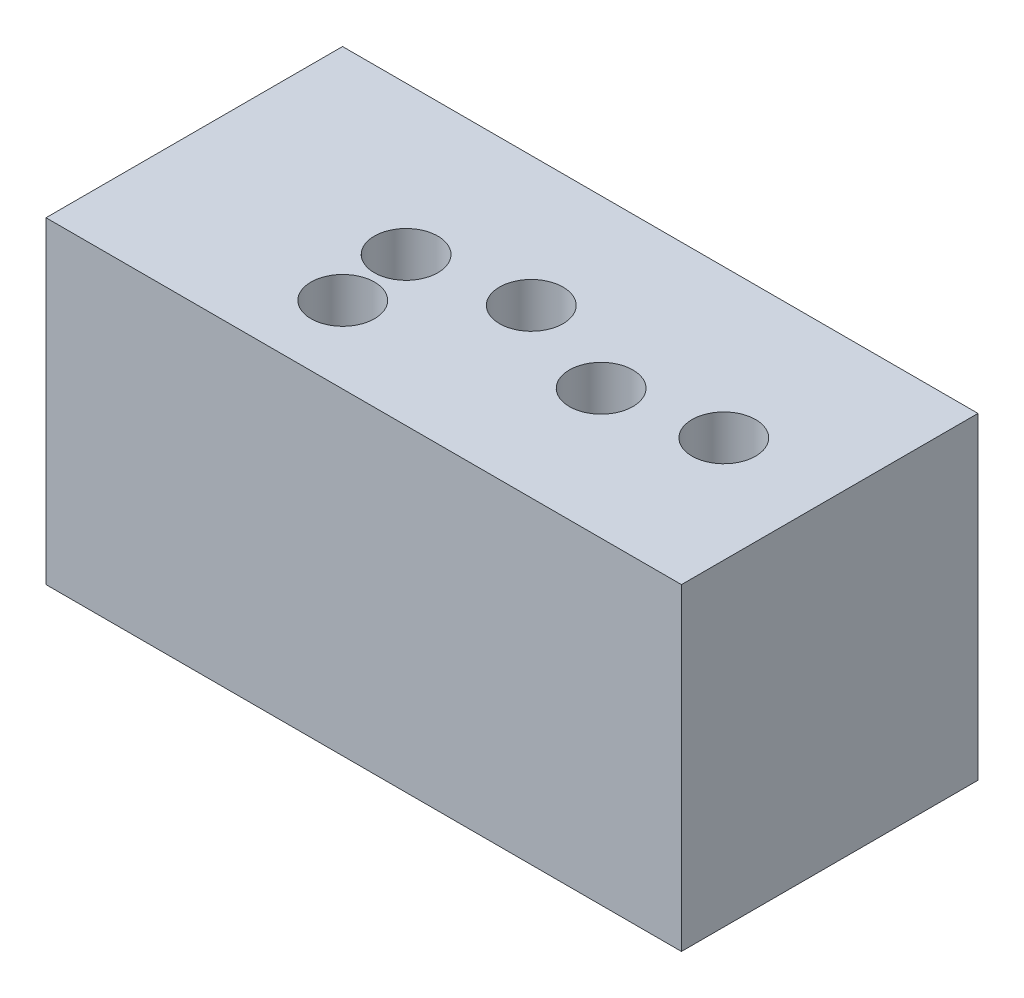
ISO-10303-21;
HEADER;
FILE_DESCRIPTION(('STEP AP214'),'2;1');
FILE_NAME('part.step','',(''),(''),'','','');
FILE_SCHEMA(('AUTOMOTIVE_DESIGN { 1 0 10303 214 1 1 1 1 }'));
ENDSEC;
DATA;
#1=APPLICATION_CONTEXT('core data for automotive mechanical design processes');
#2=APPLICATION_PROTOCOL_DEFINITION('international standard','automotive_design',2000,#1);
#3=PRODUCT_CONTEXT('',#1,'mechanical');
#4=PRODUCT('Part','Part','',(#3));
#5=PRODUCT_RELATED_PRODUCT_CATEGORY('part','',(#4));
#6=PRODUCT_DEFINITION_FORMATION('','',#4);
#7=PRODUCT_DEFINITION_CONTEXT('part definition',#1,'design');
#8=PRODUCT_DEFINITION('design','',#6,#7);
#9=PRODUCT_DEFINITION_SHAPE('','',#8);
#10=(LENGTH_UNIT() NAMED_UNIT(*) SI_UNIT(.MILLI.,.METRE.));
#11=(NAMED_UNIT(*) PLANE_ANGLE_UNIT() SI_UNIT($,.RADIAN.));
#12=(NAMED_UNIT(*) SI_UNIT($,.STERADIAN.) SOLID_ANGLE_UNIT());
#13=UNCERTAINTY_MEASURE_WITH_UNIT(LENGTH_MEASURE(1.E-05),#10,'distance_accuracy_value','');
#14=(GEOMETRIC_REPRESENTATION_CONTEXT(3) GLOBAL_UNCERTAINTY_ASSIGNED_CONTEXT((#13)) GLOBAL_UNIT_ASSIGNED_CONTEXT((#10,
#11,#12)) REPRESENTATION_CONTEXT('',''));
#15=CARTESIAN_POINT('',(0.,0.,0.));
#16=DIRECTION('',(0.,0.,1.));
#17=DIRECTION('',(1.,0.,0.));
#18=AXIS2_PLACEMENT_3D('',#15,#16,#17);
#19=CARTESIAN_POINT('',(0.,9.525,0.));
#20=DIRECTION('',(1.,0.,0.));
#21=DIRECTION('',(0.,0.,-1.));
#22=AXIS2_PLACEMENT_3D('',#19,#20,#21);
#23=PLANE('',#22);
#24=DIRECTION('',(0.,0.,1.));
#25=VECTOR('',#24,1.);
#26=CARTESIAN_POINT('',(0.,-9.525,0.));
#27=LINE('',#26,#25);
#28=CARTESIAN_POINT('',(0.,-9.525,-17.78));
#29=VERTEX_POINT('',#28);
#30=CARTESIAN_POINT('',(0.,-9.525,0.));
#31=VERTEX_POINT('',#30);
#32=EDGE_CURVE('E100',#29,#31,#27,.T.);
#33=ORIENTED_EDGE('',*,*,#32,.T.);
#34=DIRECTION('',(0.,-1.,0.));
#35=VECTOR('',#34,1.);
#36=CARTESIAN_POINT('',(0.,9.525,0.));
#37=LINE('',#36,#35);
#38=CARTESIAN_POINT('',(0.,9.525,0.));
#39=VERTEX_POINT('',#38);
#40=EDGE_CURVE('E11',#39,#31,#37,.T.);
#41=ORIENTED_EDGE('',*,*,#40,.F.);
#42=DIRECTION('',(0.,0.,1.));
#43=VECTOR('',#42,1.);
#44=CARTESIAN_POINT('',(0.,9.525,0.));
#45=LINE('',#44,#43);
#46=CARTESIAN_POINT('',(0.,9.525,-17.78));
#47=VERTEX_POINT('',#46);
#48=EDGE_CURVE('E88',#47,#39,#45,.T.);
#49=ORIENTED_EDGE('',*,*,#48,.F.);
#50=DIRECTION('',(0.,-1.,0.));
#51=VECTOR('',#50,1.);
#52=CARTESIAN_POINT('',(0.,9.525,-17.78));
#53=LINE('',#52,#51);
#54=EDGE_CURVE('E96',#47,#29,#53,.T.);
#55=ORIENTED_EDGE('',*,*,#54,.T.);
#56=EDGE_LOOP('',(#33,#41,#49,#55));
#57=FACE_BOUND('',#56,.T.);
#58=ADVANCED_FACE('F37',(#57),#23,.F.);
#59=CARTESIAN_POINT('',(0.,9.525,0.));
#60=DIRECTION('',(0.,0.,-1.));
#61=DIRECTION('',(-1.,0.,0.));
#62=AXIS2_PLACEMENT_3D('',#59,#60,#61);
#63=PLANE('',#62);
#64=DIRECTION('',(1.,0.,0.));
#65=VECTOR('',#64,1.);
#66=CARTESIAN_POINT('',(0.,-9.525,0.));
#67=LINE('',#66,#65);
#68=CARTESIAN_POINT('',(38.1,-9.525,0.));
#69=VERTEX_POINT('',#68);
#70=EDGE_CURVE('E92',#31,#69,#67,.T.);
#71=ORIENTED_EDGE('',*,*,#70,.T.);
#72=DIRECTION('',(0.,-1.,0.));
#73=VECTOR('',#72,1.);
#74=CARTESIAN_POINT('',(38.1,9.525,0.));
#75=LINE('',#74,#73);
#76=CARTESIAN_POINT('',(38.1,9.525,0.));
#77=VERTEX_POINT('',#76);
#78=EDGE_CURVE('E45',#77,#69,#75,.T.);
#79=ORIENTED_EDGE('',*,*,#78,.F.);
#80=DIRECTION('',(1.,0.,0.));
#81=VECTOR('',#80,1.);
#82=CARTESIAN_POINT('',(0.,9.525,0.));
#83=LINE('',#82,#81);
#84=EDGE_CURVE('E83',#39,#77,#83,.T.);
#85=ORIENTED_EDGE('',*,*,#84,.F.);
#86=ORIENTED_EDGE('',*,*,#40,.T.);
#87=EDGE_LOOP('',(#71,#79,#85,#86));
#88=FACE_BOUND('',#87,.T.);
#89=ADVANCED_FACE('F91',(#88),#63,.F.);
#90=CARTESIAN_POINT('',(38.1,9.525,0.));
#91=DIRECTION('',(-1.,0.,0.));
#92=DIRECTION('',(0.,0.,1.));
#93=AXIS2_PLACEMENT_3D('',#90,#91,#92);
#94=PLANE('',#93);
#95=DIRECTION('',(0.,0.,-1.));
#96=VECTOR('',#95,1.);
#97=CARTESIAN_POINT('',(38.1,-9.525,0.));
#98=LINE('',#97,#96);
#99=CARTESIAN_POINT('',(38.1,-9.525,-17.78));
#100=VERTEX_POINT('',#99);
#101=EDGE_CURVE('E70',#69,#100,#98,.T.);
#102=ORIENTED_EDGE('',*,*,#101,.T.);
#103=DIRECTION('',(0.,-1.,0.));
#104=VECTOR('',#103,1.);
#105=CARTESIAN_POINT('',(38.1,9.525,-17.78));
#106=LINE('',#105,#104);
#107=CARTESIAN_POINT('',(38.1,9.525,-17.78));
#108=VERTEX_POINT('',#107);
#109=EDGE_CURVE('E93',#108,#100,#106,.T.);
#110=ORIENTED_EDGE('',*,*,#109,.F.);
#111=DIRECTION('',(0.,0.,-1.));
#112=VECTOR('',#111,1.);
#113=CARTESIAN_POINT('',(38.1,9.525,0.));
#114=LINE('',#113,#112);
#115=EDGE_CURVE('E86',#77,#108,#114,.T.);
#116=ORIENTED_EDGE('',*,*,#115,.F.);
#117=ORIENTED_EDGE('',*,*,#78,.T.);
#118=EDGE_LOOP('',(#102,#110,#116,#117));
#119=FACE_BOUND('',#118,.T.);
#120=ADVANCED_FACE('F94',(#119),#94,.F.);
#121=CARTESIAN_POINT('',(0.,9.525,-17.78));
#122=DIRECTION('',(0.,0.,1.));
#123=DIRECTION('',(1.,0.,0.));
#124=AXIS2_PLACEMENT_3D('',#121,#122,#123);
#125=PLANE('',#124);
#126=DIRECTION('',(-1.,0.,0.));
#127=VECTOR('',#126,1.);
#128=CARTESIAN_POINT('',(0.,-9.525,-17.78));
#129=LINE('',#128,#127);
#130=EDGE_CURVE('E76',#100,#29,#129,.T.);
#131=ORIENTED_EDGE('',*,*,#130,.T.);
#132=ORIENTED_EDGE('',*,*,#54,.F.);
#133=DIRECTION('',(-1.,0.,0.));
#134=VECTOR('',#133,1.);
#135=CARTESIAN_POINT('',(0.,9.525,-17.78));
#136=LINE('',#135,#134);
#137=EDGE_CURVE('E53',#108,#47,#136,.T.);
#138=ORIENTED_EDGE('',*,*,#137,.F.);
#139=ORIENTED_EDGE('',*,*,#109,.T.);
#140=EDGE_LOOP('',(#131,#132,#138,#139));
#141=FACE_BOUND('',#140,.T.);
#142=ADVANCED_FACE('F108',(#141),#125,.F.);
#143=CARTESIAN_POINT('',(0.,9.525,0.));
#144=DIRECTION('',(0.,-1.,0.));
#145=DIRECTION('',(0.,0.,-1.));
#146=AXIS2_PLACEMENT_3D('',#143,#144,#145);
#147=PLANE('',#146);
#148=CARTESIAN_POINT('',(31.75,9.525,-8.89));
#149=DIRECTION('',(0.,1.,0.));
#150=DIRECTION('',(0.,0.,1.));
#151=AXIS2_PLACEMENT_3D('',#148,#149,#150);
#152=CIRCLE('',#151,1.90500000000001);
#153=CARTESIAN_POINT('',(31.75,9.525,-6.98499999999999));
#154=VERTEX_POINT('',#153);
#155=EDGE_CURVE('E127',#154,#154,#152,.T.);
#156=ORIENTED_EDGE('',*,*,#155,.F.);
#157=EDGE_LOOP('',(#156));
#158=FACE_BOUND('',#157,.T.);
#159=CARTESIAN_POINT('',(13.1882502658413,9.525,-4.60468241474936));
#160=DIRECTION('',(0.,1.,0.));
#161=DIRECTION('',(0.,0.,1.));
#162=AXIS2_PLACEMENT_3D('',#159,#160,#161);
#163=CIRCLE('',#162,1.90500000000001);
#164=CARTESIAN_POINT('',(13.1882502658413,9.525,-2.69968241474935));
#165=VERTEX_POINT('',#164);
#166=EDGE_CURVE('E131',#165,#165,#163,.T.);
#167=ORIENTED_EDGE('',*,*,#166,.F.);
#168=EDGE_LOOP('',(#167));
#169=FACE_BOUND('',#168,.T.);
#170=CARTESIAN_POINT('',(25.4964707683725,9.525,-7.78733407181498));
#171=DIRECTION('',(0.,1.,0.));
#172=DIRECTION('',(0.,0.,1.));
#173=AXIS2_PLACEMENT_3D('',#170,#171,#172);
#174=CIRCLE('',#173,1.90500000000001);
#175=CARTESIAN_POINT('',(25.4964707683725,9.525,-5.88233407181498));
#176=VERTEX_POINT('',#175);
#177=EDGE_CURVE('E118',#176,#176,#174,.T.);
#178=ORIENTED_EDGE('',*,*,#177,.F.);
#179=EDGE_LOOP('',(#178));
#180=FACE_BOUND('',#179,.T.);
#181=CARTESIAN_POINT('',(12.7,9.525,-8.89));
#182=DIRECTION('',(0.,1.,0.));
#183=DIRECTION('',(0.,0.,1.));
#184=AXIS2_PLACEMENT_3D('',#181,#182,#183);
#185=CIRCLE('',#184,1.90500000000001);
#186=CARTESIAN_POINT('',(12.7,9.525,-6.98499999999999));
#187=VERTEX_POINT('',#186);
#188=EDGE_CURVE('E117',#187,#187,#185,.T.);
#189=ORIENTED_EDGE('',*,*,#188,.F.);
#190=EDGE_LOOP('',(#189));
#191=FACE_BOUND('',#190,.T.);
#192=CARTESIAN_POINT('',(19.0983273342348,9.525,-9.99687793289517));
#193=DIRECTION('',(0.,1.,0.));
#194=DIRECTION('',(0.,0.,1.));
#195=AXIS2_PLACEMENT_3D('',#192,#193,#194);
#196=CIRCLE('',#195,1.90500000000001);
#197=CARTESIAN_POINT('',(19.0983273342348,9.525,-8.09187793289516));
#198=VERTEX_POINT('',#197);
#199=EDGE_CURVE('E124',#198,#198,#196,.T.);
#200=ORIENTED_EDGE('',*,*,#199,.F.);
#201=EDGE_LOOP('',(#200));
#202=FACE_BOUND('',#201,.T.);
#203=ORIENTED_EDGE('',*,*,#48,.T.);
#204=ORIENTED_EDGE('',*,*,#84,.T.);
#205=ORIENTED_EDGE('',*,*,#115,.T.);
#206=ORIENTED_EDGE('',*,*,#137,.T.);
#207=EDGE_LOOP('',(#203,#204,#205,#206));
#208=FACE_BOUND('',#207,.T.);
#209=ADVANCED_FACE('F84',(#158,#169,#180,#191,#202,#208),#147,.F.);
#210=CARTESIAN_POINT('',(0.,-9.525,0.));
#211=DIRECTION('',(0.,-1.,0.));
#212=DIRECTION('',(0.,0.,-1.));
#213=AXIS2_PLACEMENT_3D('',#210,#211,#212);
#214=PLANE('',#213);
#215=ORIENTED_EDGE('',*,*,#32,.F.);
#216=ORIENTED_EDGE('',*,*,#130,.F.);
#217=ORIENTED_EDGE('',*,*,#101,.F.);
#218=ORIENTED_EDGE('',*,*,#70,.F.);
#219=EDGE_LOOP('',(#215,#216,#217,#218));
#220=FACE_BOUND('',#219,.T.);
#221=ADVANCED_FACE('F111',(#220),#214,.T.);
#222=CARTESIAN_POINT('',(19.0983273342348,-3.175,-9.99687793289517));
#223=DIRECTION('',(0.,1.,0.));
#224=DIRECTION('',(0.,0.,1.));
#225=AXIS2_PLACEMENT_3D('',#222,#223,#224);
#226=CYLINDRICAL_SURFACE('',#225,1.90500000000001);
#227=CARTESIAN_POINT('',(19.0983273342348,-3.175,-9.99687793289517));
#228=DIRECTION('',(0.,1.,0.));
#229=DIRECTION('',(0.,0.,1.));
#230=AXIS2_PLACEMENT_3D('',#227,#228,#229);
#231=CIRCLE('',#230,1.90500000000001);
#232=CARTESIAN_POINT('',(19.0983273342348,-3.175,-8.09187793289516));
#233=VERTEX_POINT('',#232);
#234=EDGE_CURVE('E121',#233,#233,#231,.T.);
#235=ORIENTED_EDGE('',*,*,#234,.F.);
#236=EDGE_LOOP('',(#235));
#237=FACE_BOUND('',#236,.T.);
#238=ORIENTED_EDGE('',*,*,#199,.T.);
#239=EDGE_LOOP('',(#238));
#240=FACE_BOUND('',#239,.T.);
#241=ADVANCED_FACE('F164',(#237,#240),#226,.F.);
#242=CARTESIAN_POINT('',(19.0983273342348,-3.175,-9.99687793289517));
#243=DIRECTION('',(0.,1.,0.));
#244=DIRECTION('',(0.,0.,1.));
#245=AXIS2_PLACEMENT_3D('',#242,#243,#244);
#246=PLANE('',#245);
#247=ORIENTED_EDGE('',*,*,#234,.T.);
#248=EDGE_LOOP('',(#247));
#249=FACE_BOUND('',#248,.T.);
#250=ADVANCED_FACE('F166',(#249),#246,.T.);
#251=CARTESIAN_POINT('',(12.7,-3.175,-8.89));
#252=DIRECTION('',(0.,1.,0.));
#253=DIRECTION('',(0.,0.,1.));
#254=AXIS2_PLACEMENT_3D('',#251,#252,#253);
#255=CYLINDRICAL_SURFACE('',#254,1.90500000000001);
#256=CARTESIAN_POINT('',(12.7,-3.175,-8.89));
#257=DIRECTION('',(0.,1.,0.));
#258=DIRECTION('',(0.,0.,1.));
#259=AXIS2_PLACEMENT_3D('',#256,#257,#258);
#260=CIRCLE('',#259,1.90500000000001);
#261=CARTESIAN_POINT('',(12.7,-3.175,-6.98499999999999));
#262=VERTEX_POINT('',#261);
#263=EDGE_CURVE('E114',#262,#262,#260,.T.);
#264=ORIENTED_EDGE('',*,*,#263,.F.);
#265=EDGE_LOOP('',(#264));
#266=FACE_BOUND('',#265,.T.);
#267=ORIENTED_EDGE('',*,*,#188,.T.);
#268=EDGE_LOOP('',(#267));
#269=FACE_BOUND('',#268,.T.);
#270=ADVANCED_FACE('F173',(#266,#269),#255,.F.);
#271=CARTESIAN_POINT('',(12.7,-3.175,-8.89));
#272=DIRECTION('',(0.,1.,0.));
#273=DIRECTION('',(0.,0.,1.));
#274=AXIS2_PLACEMENT_3D('',#271,#272,#273);
#275=PLANE('',#274);
#276=ORIENTED_EDGE('',*,*,#263,.T.);
#277=EDGE_LOOP('',(#276));
#278=FACE_BOUND('',#277,.T.);
#279=ADVANCED_FACE('F190',(#278),#275,.T.);
#280=CARTESIAN_POINT('',(25.4964707683725,-3.175,-7.78733407181498));
#281=DIRECTION('',(0.,1.,0.));
#282=DIRECTION('',(0.,0.,1.));
#283=AXIS2_PLACEMENT_3D('',#280,#281,#282);
#284=CYLINDRICAL_SURFACE('',#283,1.90500000000001);
#285=CARTESIAN_POINT('',(25.4964707683725,-3.175,-7.78733407181498));
#286=DIRECTION('',(0.,1.,0.));
#287=DIRECTION('',(0.,0.,1.));
#288=AXIS2_PLACEMENT_3D('',#285,#286,#287);
#289=CIRCLE('',#288,1.90500000000001);
#290=CARTESIAN_POINT('',(25.4964707683725,-3.175,-5.88233407181498));
#291=VERTEX_POINT('',#290);
#292=EDGE_CURVE('E134',#291,#291,#289,.T.);
#293=ORIENTED_EDGE('',*,*,#292,.F.);
#294=EDGE_LOOP('',(#293));
#295=FACE_BOUND('',#294,.T.);
#296=ORIENTED_EDGE('',*,*,#177,.T.);
#297=EDGE_LOOP('',(#296));
#298=FACE_BOUND('',#297,.T.);
#299=ADVANCED_FACE('F193',(#295,#298),#284,.F.);
#300=CARTESIAN_POINT('',(25.4964707683725,-3.175,-7.78733407181498));
#301=DIRECTION('',(0.,1.,0.));
#302=DIRECTION('',(0.,0.,1.));
#303=AXIS2_PLACEMENT_3D('',#300,#301,#302);
#304=PLANE('',#303);
#305=ORIENTED_EDGE('',*,*,#292,.T.);
#306=EDGE_LOOP('',(#305));
#307=FACE_BOUND('',#306,.T.);
#308=ADVANCED_FACE('F213',(#307),#304,.T.);
#309=CARTESIAN_POINT('',(13.1882502658413,-3.175,-4.60468241474936));
#310=DIRECTION('',(0.,1.,0.));
#311=DIRECTION('',(0.,0.,1.));
#312=AXIS2_PLACEMENT_3D('',#309,#310,#311);
#313=CYLINDRICAL_SURFACE('',#312,1.90500000000001);
#314=CARTESIAN_POINT('',(13.1882502658413,-3.175,-4.60468241474936));
#315=DIRECTION('',(0.,1.,0.));
#316=DIRECTION('',(0.,0.,1.));
#317=AXIS2_PLACEMENT_3D('',#314,#315,#316);
#318=CIRCLE('',#317,1.90500000000001);
#319=CARTESIAN_POINT('',(13.1882502658413,-3.175,-2.69968241474935));
#320=VERTEX_POINT('',#319);
#321=EDGE_CURVE('E128',#320,#320,#318,.T.);
#322=ORIENTED_EDGE('',*,*,#321,.F.);
#323=EDGE_LOOP('',(#322));
#324=FACE_BOUND('',#323,.T.);
#325=ORIENTED_EDGE('',*,*,#166,.T.);
#326=EDGE_LOOP('',(#325));
#327=FACE_BOUND('',#326,.T.);
#328=ADVANCED_FACE('F221',(#324,#327),#313,.F.);
#329=CARTESIAN_POINT('',(13.1882502658413,-3.175,-4.60468241474936));
#330=DIRECTION('',(0.,1.,0.));
#331=DIRECTION('',(0.,0.,1.));
#332=AXIS2_PLACEMENT_3D('',#329,#330,#331);
#333=PLANE('',#332);
#334=ORIENTED_EDGE('',*,*,#321,.T.);
#335=EDGE_LOOP('',(#334));
#336=FACE_BOUND('',#335,.T.);
#337=ADVANCED_FACE('F149',(#336),#333,.T.);
#338=CARTESIAN_POINT('',(31.75,-3.175,-8.89));
#339=DIRECTION('',(0.,1.,0.));
#340=DIRECTION('',(0.,0.,1.));
#341=AXIS2_PLACEMENT_3D('',#338,#339,#340);
#342=CYLINDRICAL_SURFACE('',#341,1.90500000000001);
#343=CARTESIAN_POINT('',(31.75,-3.175,-8.89));
#344=DIRECTION('',(0.,1.,0.));
#345=DIRECTION('',(0.,0.,1.));
#346=AXIS2_PLACEMENT_3D('',#343,#344,#345);
#347=CIRCLE('',#346,1.90500000000001);
#348=CARTESIAN_POINT('',(31.75,-3.175,-6.98499999999999));
#349=VERTEX_POINT('',#348);
#350=EDGE_CURVE('E103',#349,#349,#347,.T.);
#351=ORIENTED_EDGE('',*,*,#350,.F.);
#352=EDGE_LOOP('',(#351));
#353=FACE_BOUND('',#352,.T.);
#354=ORIENTED_EDGE('',*,*,#155,.T.);
#355=EDGE_LOOP('',(#354));
#356=FACE_BOUND('',#355,.T.);
#357=ADVANCED_FACE('F146',(#353,#356),#342,.F.);
#358=CARTESIAN_POINT('',(31.75,-3.175,-8.89));
#359=DIRECTION('',(0.,1.,0.));
#360=DIRECTION('',(0.,0.,1.));
#361=AXIS2_PLACEMENT_3D('',#358,#359,#360);
#362=PLANE('',#361);
#363=ORIENTED_EDGE('',*,*,#350,.T.);
#364=EDGE_LOOP('',(#363));
#365=FACE_BOUND('',#364,.T.);
#366=ADVANCED_FACE('F144',(#365),#362,.T.);
#367=CLOSED_SHELL('',(#58,#89,#120,#142,#209,#221,#241,#250,#270,#279,#299,#308,#328,#337,#357,#366));
#368=MANIFOLD_SOLID_BREP('B2',#367);
#369=ADVANCED_BREP_SHAPE_REPRESENTATION('',(#18,#368),#14);
#370=SHAPE_DEFINITION_REPRESENTATION(#9,#369);
ENDSEC;
END-ISO-10303-21;
